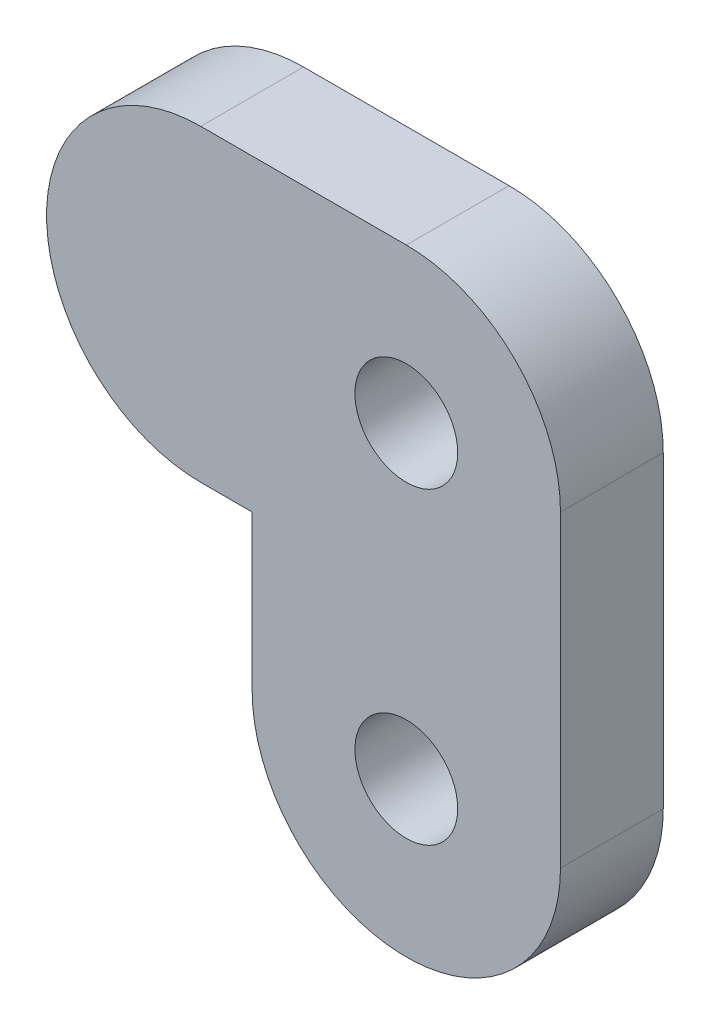
ISO-10303-21;
HEADER;
FILE_DESCRIPTION(('STEP AP214'),'2;1');
FILE_NAME('part.step','',(''),(''),'','','');
FILE_SCHEMA(('AUTOMOTIVE_DESIGN { 1 0 10303 214 1 1 1 1 }'));
ENDSEC;
DATA;
#1=APPLICATION_CONTEXT('core data for automotive mechanical design processes');
#2=APPLICATION_PROTOCOL_DEFINITION('international standard','automotive_design',2000,#1);
#3=PRODUCT_CONTEXT('',#1,'mechanical');
#4=PRODUCT('Part','Part','',(#3));
#5=PRODUCT_RELATED_PRODUCT_CATEGORY('part','',(#4));
#6=PRODUCT_DEFINITION_FORMATION('','',#4);
#7=PRODUCT_DEFINITION_CONTEXT('part definition',#1,'design');
#8=PRODUCT_DEFINITION('design','',#6,#7);
#9=PRODUCT_DEFINITION_SHAPE('','',#8);
#10=(LENGTH_UNIT() NAMED_UNIT(*) SI_UNIT(.MILLI.,.METRE.));
#11=(NAMED_UNIT(*) PLANE_ANGLE_UNIT() SI_UNIT($,.RADIAN.));
#12=(NAMED_UNIT(*) SI_UNIT($,.STERADIAN.) SOLID_ANGLE_UNIT());
#13=UNCERTAINTY_MEASURE_WITH_UNIT(LENGTH_MEASURE(1.E-05),#10,'distance_accuracy_value','');
#14=(GEOMETRIC_REPRESENTATION_CONTEXT(3) GLOBAL_UNCERTAINTY_ASSIGNED_CONTEXT((#13)) GLOBAL_UNIT_ASSIGNED_CONTEXT((#10,
#11,#12)) REPRESENTATION_CONTEXT('',''));
#15=CARTESIAN_POINT('',(0.,0.,0.));
#16=DIRECTION('',(0.,0.,1.));
#17=DIRECTION('',(1.,0.,0.));
#18=AXIS2_PLACEMENT_3D('',#15,#16,#17);
#19=CARTESIAN_POINT('',(152.3421335095,207.323953209,3.));
#20=DIRECTION('',(0.,0.,1.));
#21=DIRECTION('',(1.,0.,0.));
#22=AXIS2_PLACEMENT_3D('',#19,#20,#21);
#23=PLANE('',#22);
#24=CARTESIAN_POINT('',(158.3421335095,207.323953209,3.));
#25=DIRECTION('',(0.,0.,1.));
#26=DIRECTION('',(1.,0.,0.));
#27=AXIS2_PLACEMENT_3D('',#24,#25,#26);
#28=CIRCLE('',#27,1.5);
#29=CARTESIAN_POINT('',(159.8421335095,207.323953209,3.));
#30=VERTEX_POINT('',#29);
#31=EDGE_CURVE('E128',#30,#30,#28,.T.);
#32=ORIENTED_EDGE('',*,*,#31,.F.);
#33=EDGE_LOOP('',(#32));
#34=FACE_BOUND('',#33,.T.);
#35=CARTESIAN_POINT('',(152.3421335095,207.323953209,3.));
#36=DIRECTION('',(0.,0.,1.));
#37=DIRECTION('',(1.,0.,0.));
#38=AXIS2_PLACEMENT_3D('',#35,#36,#37);
#39=CIRCLE('',#38,4.49999999999999);
#40=CARTESIAN_POINT('',(152.3421335095,211.823953209,3.));
#41=VERTEX_POINT('',#40);
#42=CARTESIAN_POINT('',(152.3421335095,202.823953209,3.));
#43=VERTEX_POINT('',#42);
#44=EDGE_CURVE('E137',#41,#43,#39,.T.);
#45=ORIENTED_EDGE('',*,*,#44,.T.);
#46=DIRECTION('',(1.,0.,0.));
#47=VECTOR('',#46,1.);
#48=CARTESIAN_POINT('',(153.8421335095,202.823953209,3.));
#49=LINE('',#48,#47);
#50=CARTESIAN_POINT('',(153.8421335095,202.823953209,3.));
#51=VERTEX_POINT('',#50);
#52=EDGE_CURVE('E90',#43,#51,#49,.T.);
#53=ORIENTED_EDGE('',*,*,#52,.T.);
#54=DIRECTION('',(0.,-1.,0.));
#55=VECTOR('',#54,1.);
#56=CARTESIAN_POINT('',(153.8421335095,198.323953209,3.));
#57=LINE('',#56,#55);
#58=CARTESIAN_POINT('',(153.8421335095,198.323953209,3.));
#59=VERTEX_POINT('',#58);
#60=EDGE_CURVE('E149',#51,#59,#57,.T.);
#61=ORIENTED_EDGE('',*,*,#60,.T.);
#62=CARTESIAN_POINT('',(158.3421335095,198.323953209,3.));
#63=DIRECTION('',(0.,0.,1.));
#64=DIRECTION('',(1.,0.,0.));
#65=AXIS2_PLACEMENT_3D('',#62,#63,#64);
#66=CIRCLE('',#65,4.49999999999999);
#67=CARTESIAN_POINT('',(162.8421335095,198.323953209,3.));
#68=VERTEX_POINT('',#67);
#69=EDGE_CURVE('E106',#59,#68,#66,.T.);
#70=ORIENTED_EDGE('',*,*,#69,.T.);
#71=DIRECTION('',(0.,1.,0.));
#72=VECTOR('',#71,1.);
#73=CARTESIAN_POINT('',(162.8421335095,198.323953209,3.));
#74=LINE('',#73,#72);
#75=CARTESIAN_POINT('',(162.8421335095,207.323953209,3.));
#76=VERTEX_POINT('',#75);
#77=EDGE_CURVE('E100',#68,#76,#74,.T.);
#78=ORIENTED_EDGE('',*,*,#77,.T.);
#79=CARTESIAN_POINT('',(158.3421335095,207.323953209,3.));
#80=DIRECTION('',(0.,0.,1.));
#81=DIRECTION('',(1.,0.,0.));
#82=AXIS2_PLACEMENT_3D('',#79,#80,#81);
#83=CIRCLE('',#82,4.5);
#84=CARTESIAN_POINT('',(158.3421335095,211.823953209,3.));
#85=VERTEX_POINT('',#84);
#86=EDGE_CURVE('E104',#76,#85,#83,.T.);
#87=ORIENTED_EDGE('',*,*,#86,.T.);
#88=DIRECTION('',(-1.,0.,0.));
#89=VECTOR('',#88,1.);
#90=CARTESIAN_POINT('',(152.3421335095,211.823953209,3.));
#91=LINE('',#90,#89);
#92=EDGE_CURVE('E50',#85,#41,#91,.T.);
#93=ORIENTED_EDGE('',*,*,#92,.T.);
#94=EDGE_LOOP('',(#45,#53,#61,#70,#78,#87,#93));
#95=FACE_BOUND('',#94,.T.);
#96=CARTESIAN_POINT('',(158.3421335095,198.323953209,3.));
#97=DIRECTION('',(0.,0.,1.));
#98=DIRECTION('',(1.,0.,0.));
#99=AXIS2_PLACEMENT_3D('',#96,#97,#98);
#100=CIRCLE('',#99,1.5);
#101=CARTESIAN_POINT('',(159.8421335095,198.323953209,3.));
#102=VERTEX_POINT('',#101);
#103=EDGE_CURVE('E164',#102,#102,#100,.T.);
#104=ORIENTED_EDGE('',*,*,#103,.F.);
#105=EDGE_LOOP('',(#104));
#106=FACE_BOUND('',#105,.T.);
#107=ADVANCED_FACE('F33',(#34,#95,#106),#23,.T.);
#108=CARTESIAN_POINT('',(152.3421335095,207.323953209,0.));
#109=DIRECTION('',(0.,0.,1.));
#110=DIRECTION('',(1.,0.,0.));
#111=AXIS2_PLACEMENT_3D('',#108,#109,#110);
#112=PLANE('',#111);
#113=CARTESIAN_POINT('',(158.3421335095,207.323953209,0.));
#114=DIRECTION('',(0.,0.,1.));
#115=DIRECTION('',(1.,0.,0.));
#116=AXIS2_PLACEMENT_3D('',#113,#114,#115);
#117=CIRCLE('',#116,1.5);
#118=CARTESIAN_POINT('',(159.8421335095,207.323953209,0.));
#119=VERTEX_POINT('',#118);
#120=EDGE_CURVE('E161',#119,#119,#117,.T.);
#121=ORIENTED_EDGE('',*,*,#120,.T.);
#122=EDGE_LOOP('',(#121));
#123=FACE_BOUND('',#122,.T.);
#124=CARTESIAN_POINT('',(152.3421335095,207.323953209,0.));
#125=DIRECTION('',(0.,0.,1.));
#126=DIRECTION('',(1.,0.,0.));
#127=AXIS2_PLACEMENT_3D('',#124,#125,#126);
#128=CIRCLE('',#127,4.49999999999999);
#129=CARTESIAN_POINT('',(152.3421335095,211.823953209,0.));
#130=VERTEX_POINT('',#129);
#131=CARTESIAN_POINT('',(152.3421335095,202.823953209,0.));
#132=VERTEX_POINT('',#131);
#133=EDGE_CURVE('E124',#130,#132,#128,.T.);
#134=ORIENTED_EDGE('',*,*,#133,.F.);
#135=DIRECTION('',(-1.,0.,0.));
#136=VECTOR('',#135,1.);
#137=CARTESIAN_POINT('',(152.3421335095,211.823953209,0.));
#138=LINE('',#137,#136);
#139=CARTESIAN_POINT('',(158.3421335095,211.823953209,0.));
#140=VERTEX_POINT('',#139);
#141=EDGE_CURVE('E82',#140,#130,#138,.T.);
#142=ORIENTED_EDGE('',*,*,#141,.F.);
#143=CARTESIAN_POINT('',(158.3421335095,207.323953209,0.));
#144=DIRECTION('',(0.,0.,1.));
#145=DIRECTION('',(1.,0.,0.));
#146=AXIS2_PLACEMENT_3D('',#143,#144,#145);
#147=CIRCLE('',#146,4.5);
#148=CARTESIAN_POINT('',(162.8421335095,207.323953209,0.));
#149=VERTEX_POINT('',#148);
#150=EDGE_CURVE('E76',#149,#140,#147,.T.);
#151=ORIENTED_EDGE('',*,*,#150,.F.);
#152=DIRECTION('',(0.,1.,0.));
#153=VECTOR('',#152,1.);
#154=CARTESIAN_POINT('',(162.8421335095,198.323953209,0.));
#155=LINE('',#154,#153);
#156=CARTESIAN_POINT('',(162.8421335095,198.323953209,0.));
#157=VERTEX_POINT('',#156);
#158=EDGE_CURVE('E114',#157,#149,#155,.T.);
#159=ORIENTED_EDGE('',*,*,#158,.F.);
#160=CARTESIAN_POINT('',(158.3421335095,198.323953209,0.));
#161=DIRECTION('',(0.,0.,1.));
#162=DIRECTION('',(1.,0.,0.));
#163=AXIS2_PLACEMENT_3D('',#160,#161,#162);
#164=CIRCLE('',#163,4.49999999999999);
#165=CARTESIAN_POINT('',(153.8421335095,198.323953209,0.));
#166=VERTEX_POINT('',#165);
#167=EDGE_CURVE('E132',#166,#157,#164,.T.);
#168=ORIENTED_EDGE('',*,*,#167,.F.);
#169=DIRECTION('',(0.,-1.,0.));
#170=VECTOR('',#169,1.);
#171=CARTESIAN_POINT('',(153.8421335095,198.323953209,0.));
#172=LINE('',#171,#170);
#173=CARTESIAN_POINT('',(153.8421335095,202.823953209,0.));
#174=VERTEX_POINT('',#173);
#175=EDGE_CURVE('E130',#174,#166,#172,.T.);
#176=ORIENTED_EDGE('',*,*,#175,.F.);
#177=DIRECTION('',(1.,0.,0.));
#178=VECTOR('',#177,1.);
#179=CARTESIAN_POINT('',(153.8421335095,202.823953209,0.));
#180=LINE('',#179,#178);
#181=EDGE_CURVE('E127',#132,#174,#180,.T.);
#182=ORIENTED_EDGE('',*,*,#181,.F.);
#183=EDGE_LOOP('',(#134,#142,#151,#159,#168,#176,#182));
#184=FACE_BOUND('',#183,.T.);
#185=CARTESIAN_POINT('',(158.3421335095,198.323953209,0.));
#186=DIRECTION('',(0.,0.,1.));
#187=DIRECTION('',(1.,0.,0.));
#188=AXIS2_PLACEMENT_3D('',#185,#186,#187);
#189=CIRCLE('',#188,1.5);
#190=CARTESIAN_POINT('',(159.8421335095,198.323953209,0.));
#191=VERTEX_POINT('',#190);
#192=EDGE_CURVE('E167',#191,#191,#189,.T.);
#193=ORIENTED_EDGE('',*,*,#192,.T.);
#194=EDGE_LOOP('',(#193));
#195=FACE_BOUND('',#194,.T.);
#196=ADVANCED_FACE('F153',(#123,#184,#195),#112,.F.);
#197=CARTESIAN_POINT('',(152.3421335095,207.323953209,3.));
#198=DIRECTION('',(0.,0.,-1.));
#199=DIRECTION('',(-1.,0.,0.));
#200=AXIS2_PLACEMENT_3D('',#197,#198,#199);
#201=CYLINDRICAL_SURFACE('',#200,4.49999999999999);
#202=ORIENTED_EDGE('',*,*,#133,.T.);
#203=DIRECTION('',(0.,0.,-1.));
#204=VECTOR('',#203,1.);
#205=CARTESIAN_POINT('',(152.3421335095,202.823953209,3.));
#206=LINE('',#205,#204);
#207=EDGE_CURVE('E11',#43,#132,#206,.T.);
#208=ORIENTED_EDGE('',*,*,#207,.F.);
#209=ORIENTED_EDGE('',*,*,#44,.F.);
#210=DIRECTION('',(0.,0.,-1.));
#211=VECTOR('',#210,1.);
#212=CARTESIAN_POINT('',(152.3421335095,211.823953209,3.));
#213=LINE('',#212,#211);
#214=EDGE_CURVE('E120',#41,#130,#213,.T.);
#215=ORIENTED_EDGE('',*,*,#214,.T.);
#216=EDGE_LOOP('',(#202,#208,#209,#215));
#217=FACE_BOUND('',#216,.T.);
#218=ADVANCED_FACE('F35',(#217),#201,.T.);
#219=CARTESIAN_POINT('',(153.8421335095,202.823953209,3.));
#220=DIRECTION('',(0.,1.,0.));
#221=DIRECTION('',(0.,0.,1.));
#222=AXIS2_PLACEMENT_3D('',#219,#220,#221);
#223=PLANE('',#222);
#224=ORIENTED_EDGE('',*,*,#181,.T.);
#225=DIRECTION('',(0.,0.,-1.));
#226=VECTOR('',#225,1.);
#227=CARTESIAN_POINT('',(153.8421335095,202.823953209,3.));
#228=LINE('',#227,#226);
#229=EDGE_CURVE('E42',#51,#174,#228,.T.);
#230=ORIENTED_EDGE('',*,*,#229,.F.);
#231=ORIENTED_EDGE('',*,*,#52,.F.);
#232=ORIENTED_EDGE('',*,*,#207,.T.);
#233=EDGE_LOOP('',(#224,#230,#231,#232));
#234=FACE_BOUND('',#233,.T.);
#235=ADVANCED_FACE('F198',(#234),#223,.F.);
#236=CARTESIAN_POINT('',(153.8421335095,198.323953209,3.));
#237=DIRECTION('',(1.,0.,0.));
#238=DIRECTION('',(0.,0.,-1.));
#239=AXIS2_PLACEMENT_3D('',#236,#237,#238);
#240=PLANE('',#239);
#241=ORIENTED_EDGE('',*,*,#175,.T.);
#242=DIRECTION('',(0.,0.,-1.));
#243=VECTOR('',#242,1.);
#244=CARTESIAN_POINT('',(153.8421335095,198.323953209,3.));
#245=LINE('',#244,#243);
#246=EDGE_CURVE('E141',#59,#166,#245,.T.);
#247=ORIENTED_EDGE('',*,*,#246,.F.);
#248=ORIENTED_EDGE('',*,*,#60,.F.);
#249=ORIENTED_EDGE('',*,*,#229,.T.);
#250=EDGE_LOOP('',(#241,#247,#248,#249));
#251=FACE_BOUND('',#250,.T.);
#252=ADVANCED_FACE('F147',(#251),#240,.F.);
#253=CARTESIAN_POINT('',(158.3421335095,198.323953209,3.));
#254=DIRECTION('',(0.,0.,-1.));
#255=DIRECTION('',(-1.,0.,0.));
#256=AXIS2_PLACEMENT_3D('',#253,#254,#255);
#257=CYLINDRICAL_SURFACE('',#256,4.49999999999999);
#258=ORIENTED_EDGE('',*,*,#167,.T.);
#259=DIRECTION('',(0.,0.,-1.));
#260=VECTOR('',#259,1.);
#261=CARTESIAN_POINT('',(162.8421335095,198.323953209,3.));
#262=LINE('',#261,#260);
#263=EDGE_CURVE('E115',#68,#157,#262,.T.);
#264=ORIENTED_EDGE('',*,*,#263,.F.);
#265=ORIENTED_EDGE('',*,*,#69,.F.);
#266=ORIENTED_EDGE('',*,*,#246,.T.);
#267=EDGE_LOOP('',(#258,#264,#265,#266));
#268=FACE_BOUND('',#267,.T.);
#269=ADVANCED_FACE('F156',(#268),#257,.T.);
#270=CARTESIAN_POINT('',(162.8421335095,198.323953209,3.));
#271=DIRECTION('',(-1.,0.,0.));
#272=DIRECTION('',(0.,0.,1.));
#273=AXIS2_PLACEMENT_3D('',#270,#271,#272);
#274=PLANE('',#273);
#275=ORIENTED_EDGE('',*,*,#158,.T.);
#276=DIRECTION('',(0.,0.,-1.));
#277=VECTOR('',#276,1.);
#278=CARTESIAN_POINT('',(162.8421335095,207.323953209,3.));
#279=LINE('',#278,#277);
#280=EDGE_CURVE('E111',#76,#149,#279,.T.);
#281=ORIENTED_EDGE('',*,*,#280,.F.);
#282=ORIENTED_EDGE('',*,*,#77,.F.);
#283=ORIENTED_EDGE('',*,*,#263,.T.);
#284=EDGE_LOOP('',(#275,#281,#282,#283));
#285=FACE_BOUND('',#284,.T.);
#286=ADVANCED_FACE('F112',(#285),#274,.F.);
#287=CARTESIAN_POINT('',(158.3421335095,207.323953209,3.));
#288=DIRECTION('',(0.,0.,-1.));
#289=DIRECTION('',(-1.,0.,0.));
#290=AXIS2_PLACEMENT_3D('',#287,#288,#289);
#291=CYLINDRICAL_SURFACE('',#290,4.5);
#292=ORIENTED_EDGE('',*,*,#150,.T.);
#293=DIRECTION('',(0.,0.,-1.));
#294=VECTOR('',#293,1.);
#295=CARTESIAN_POINT('',(158.3421335095,211.823953209,3.));
#296=LINE('',#295,#294);
#297=EDGE_CURVE('E116',#85,#140,#296,.T.);
#298=ORIENTED_EDGE('',*,*,#297,.F.);
#299=ORIENTED_EDGE('',*,*,#86,.F.);
#300=ORIENTED_EDGE('',*,*,#280,.T.);
#301=EDGE_LOOP('',(#292,#298,#299,#300));
#302=FACE_BOUND('',#301,.T.);
#303=ADVANCED_FACE('F118',(#302),#291,.T.);
#304=CARTESIAN_POINT('',(152.3421335095,211.823953209,3.));
#305=DIRECTION('',(0.,-1.,0.));
#306=DIRECTION('',(0.,0.,-1.));
#307=AXIS2_PLACEMENT_3D('',#304,#305,#306);
#308=PLANE('',#307);
#309=ORIENTED_EDGE('',*,*,#141,.T.);
#310=ORIENTED_EDGE('',*,*,#214,.F.);
#311=ORIENTED_EDGE('',*,*,#92,.F.);
#312=ORIENTED_EDGE('',*,*,#297,.T.);
#313=EDGE_LOOP('',(#309,#310,#311,#312));
#314=FACE_BOUND('',#313,.T.);
#315=ADVANCED_FACE('F188',(#314),#308,.F.);
#316=CARTESIAN_POINT('',(158.3421335095,207.323953209,3.));
#317=DIRECTION('',(0.,0.,-1.));
#318=DIRECTION('',(-1.,0.,0.));
#319=AXIS2_PLACEMENT_3D('',#316,#317,#318);
#320=CYLINDRICAL_SURFACE('',#319,1.5);
#321=ORIENTED_EDGE('',*,*,#31,.T.);
#322=EDGE_LOOP('',(#321));
#323=FACE_BOUND('',#322,.T.);
#324=ORIENTED_EDGE('',*,*,#120,.F.);
#325=EDGE_LOOP('',(#324));
#326=FACE_BOUND('',#325,.T.);
#327=ADVANCED_FACE('F185',(#323,#326),#320,.F.);
#328=CARTESIAN_POINT('',(158.3421335095,198.323953209,3.));
#329=DIRECTION('',(0.,0.,-1.));
#330=DIRECTION('',(-1.,0.,0.));
#331=AXIS2_PLACEMENT_3D('',#328,#329,#330);
#332=CYLINDRICAL_SURFACE('',#331,1.5);
#333=ORIENTED_EDGE('',*,*,#103,.T.);
#334=EDGE_LOOP('',(#333));
#335=FACE_BOUND('',#334,.T.);
#336=ORIENTED_EDGE('',*,*,#192,.F.);
#337=EDGE_LOOP('',(#336));
#338=FACE_BOUND('',#337,.T.);
#339=ADVANCED_FACE('F173',(#335,#338),#332,.F.);
#340=CLOSED_SHELL('',(#107,#196,#218,#235,#252,#269,#286,#303,#315,#327,#339));
#341=MANIFOLD_SOLID_BREP('B2',#340);
#342=ADVANCED_BREP_SHAPE_REPRESENTATION('',(#18,#341),#14);
#343=SHAPE_DEFINITION_REPRESENTATION(#9,#342);
ENDSEC;
END-ISO-10303-21;
